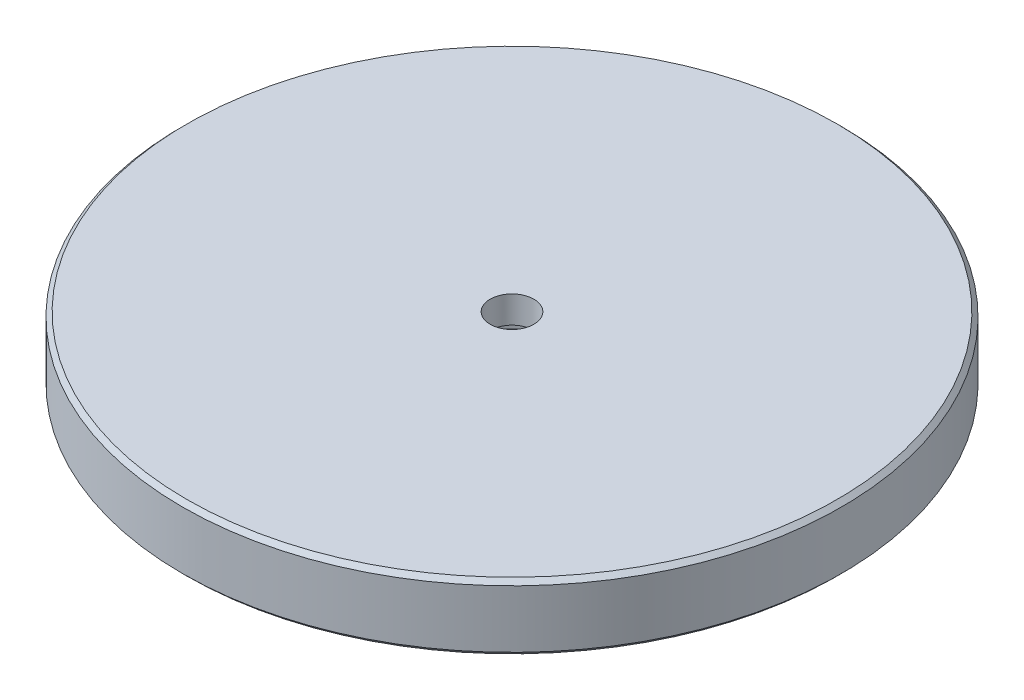
ISO-10303-21;
HEADER;
FILE_DESCRIPTION(('STEP AP214'),'2;1');
FILE_NAME('part.step','',(''),(''),'','','');
FILE_SCHEMA(('AUTOMOTIVE_DESIGN { 1 0 10303 214 1 1 1 1 }'));
ENDSEC;
DATA;
#1=APPLICATION_CONTEXT('core data for automotive mechanical design processes');
#2=APPLICATION_PROTOCOL_DEFINITION('international standard','automotive_design',2000,#1);
#3=PRODUCT_CONTEXT('',#1,'mechanical');
#4=PRODUCT('Part','Part','',(#3));
#5=PRODUCT_RELATED_PRODUCT_CATEGORY('part','',(#4));
#6=PRODUCT_DEFINITION_FORMATION('','',#4);
#7=PRODUCT_DEFINITION_CONTEXT('part definition',#1,'design');
#8=PRODUCT_DEFINITION('design','',#6,#7);
#9=PRODUCT_DEFINITION_SHAPE('','',#8);
#10=(LENGTH_UNIT() NAMED_UNIT(*) SI_UNIT(.MILLI.,.METRE.));
#11=(NAMED_UNIT(*) PLANE_ANGLE_UNIT() SI_UNIT($,.RADIAN.));
#12=(NAMED_UNIT(*) SI_UNIT($,.STERADIAN.) SOLID_ANGLE_UNIT());
#13=UNCERTAINTY_MEASURE_WITH_UNIT(LENGTH_MEASURE(1.E-05),#10,'distance_accuracy_value','');
#14=(GEOMETRIC_REPRESENTATION_CONTEXT(3) GLOBAL_UNCERTAINTY_ASSIGNED_CONTEXT((#13)) GLOBAL_UNIT_ASSIGNED_CONTEXT((#10,
#11,#12)) REPRESENTATION_CONTEXT('',''));
#15=CARTESIAN_POINT('',(0.,0.,0.));
#16=DIRECTION('',(0.,0.,1.));
#17=DIRECTION('',(1.,0.,0.));
#18=AXIS2_PLACEMENT_3D('',#15,#16,#17);
#19=CARTESIAN_POINT('',(0.,15.2,0.));
#20=DIRECTION('',(0.,-1.,0.));
#21=DIRECTION('',(0.,0.,-1.));
#22=AXIS2_PLACEMENT_3D('',#19,#20,#21);
#23=CYLINDRICAL_SURFACE('',#22,75.5);
#24=CARTESIAN_POINT('',(0.,14.2,0.));
#25=DIRECTION('',(0.,1.,0.));
#26=DIRECTION('',(0.,0.,1.));
#27=AXIS2_PLACEMENT_3D('',#24,#25,#26);
#28=CIRCLE('',#27,75.5);
#29=CARTESIAN_POINT('',(0.,14.2,-75.5));
#30=VERTEX_POINT('',#29);
#31=EDGE_CURVE('E37',#30,#30,#28,.F.);
#32=CARTESIAN_POINT('',(0.,1.00000000000007,0.));
#33=DIRECTION('',(0.,1.,0.));
#34=DIRECTION('',(0.,0.,1.));
#35=AXIS2_PLACEMENT_3D('',#32,#33,#34);
#36=CIRCLE('',#35,75.5);
#37=CARTESIAN_POINT('',(0.,1.00000000000007,-75.5));
#38=VERTEX_POINT('',#37);
#39=EDGE_CURVE('E41',#38,#38,#36,.T.);
#40=CARTESIAN_POINT('',(0.,14.2,-75.5));
#41=CARTESIAN_POINT('',(0.,14.0625,-75.5));
#42=CARTESIAN_POINT('',(0.,13.925,-75.5));
#43=CARTESIAN_POINT('',(0.,13.65,-75.5));
#44=CARTESIAN_POINT('',(0.,13.5125,-75.5));
#45=CARTESIAN_POINT('',(0.,13.2375,-75.5));
#46=CARTESIAN_POINT('',(0.,13.1,-75.5));
#47=CARTESIAN_POINT('',(0.,12.825,-75.5));
#48=CARTESIAN_POINT('',(0.,12.6875,-75.5));
#49=CARTESIAN_POINT('',(0.,12.4125,-75.5));
#50=CARTESIAN_POINT('',(0.,12.275,-75.5));
#51=CARTESIAN_POINT('',(0.,12.,-75.5));
#52=CARTESIAN_POINT('',(0.,11.8625,-75.5));
#53=CARTESIAN_POINT('',(0.,11.5875,-75.5));
#54=CARTESIAN_POINT('',(0.,11.45,-75.5));
#55=CARTESIAN_POINT('',(0.,11.175,-75.5));
#56=CARTESIAN_POINT('',(0.,11.0375,-75.5));
#57=CARTESIAN_POINT('',(0.,10.7625,-75.5));
#58=CARTESIAN_POINT('',(0.,10.625,-75.5));
#59=CARTESIAN_POINT('',(0.,10.35,-75.5));
#60=CARTESIAN_POINT('',(0.,10.2125,-75.5));
#61=CARTESIAN_POINT('',(0.,9.93750000000003,-75.5));
#62=CARTESIAN_POINT('',(0.,9.80000000000003,-75.5));
#63=CARTESIAN_POINT('',(0.,9.52500000000003,-75.5));
#64=CARTESIAN_POINT('',(0.,9.38750000000003,-75.5));
#65=CARTESIAN_POINT('',(0.,9.11250000000004,-75.5));
#66=CARTESIAN_POINT('',(0.,8.97500000000004,-75.5));
#67=CARTESIAN_POINT('',(0.,8.70000000000004,-75.5));
#68=CARTESIAN_POINT('',(0.,8.56250000000004,-75.5));
#69=CARTESIAN_POINT('',(0.,8.28750000000004,-75.5));
#70=CARTESIAN_POINT('',(0.,8.15000000000004,-75.5));
#71=CARTESIAN_POINT('',(0.,7.87500000000004,-75.5));
#72=CARTESIAN_POINT('',(0.,7.73750000000004,-75.5));
#73=CARTESIAN_POINT('',(0.,7.46250000000004,-75.5));
#74=CARTESIAN_POINT('',(0.,7.32500000000004,-75.5));
#75=CARTESIAN_POINT('',(0.,7.05000000000005,-75.5));
#76=CARTESIAN_POINT('',(0.,6.91250000000004,-75.5));
#77=CARTESIAN_POINT('',(0.,6.63750000000005,-75.5));
#78=CARTESIAN_POINT('',(0.,6.50000000000004,-75.5));
#79=CARTESIAN_POINT('',(0.,6.22500000000005,-75.5));
#80=CARTESIAN_POINT('',(0.,6.08750000000005,-75.5));
#81=CARTESIAN_POINT('',(0.,5.81250000000005,-75.5));
#82=CARTESIAN_POINT('',(0.,5.67500000000005,-75.5));
#83=CARTESIAN_POINT('',(0.,5.40000000000005,-75.5));
#84=CARTESIAN_POINT('',(0.,5.26250000000005,-75.5));
#85=CARTESIAN_POINT('',(0.,4.98750000000005,-75.5));
#86=CARTESIAN_POINT('',(0.,4.85000000000005,-75.5));
#87=CARTESIAN_POINT('',(0.,4.57500000000005,-75.5));
#88=CARTESIAN_POINT('',(0.,4.43750000000006,-75.5));
#89=CARTESIAN_POINT('',(0.,4.16250000000006,-75.5));
#90=CARTESIAN_POINT('',(0.,4.02500000000006,-75.5));
#91=CARTESIAN_POINT('',(0.,3.75000000000006,-75.5));
#92=CARTESIAN_POINT('',(0.,3.61250000000006,-75.5));
#93=CARTESIAN_POINT('',(0.,3.33750000000006,-75.5));
#94=CARTESIAN_POINT('',(0.,3.20000000000006,-75.5));
#95=CARTESIAN_POINT('',(0.,2.92500000000006,-75.5));
#96=CARTESIAN_POINT('',(0.,2.78750000000006,-75.5));
#97=CARTESIAN_POINT('',(0.,2.51250000000006,-75.5));
#98=CARTESIAN_POINT('',(0.,2.37500000000006,-75.5));
#99=CARTESIAN_POINT('',(0.,2.10000000000007,-75.5));
#100=CARTESIAN_POINT('',(0.,1.96250000000007,-75.5));
#101=CARTESIAN_POINT('',(0.,1.68750000000007,-75.5));
#102=CARTESIAN_POINT('',(0.,1.55000000000007,-75.5));
#103=CARTESIAN_POINT('',(0.,1.27500000000007,-75.5));
#104=CARTESIAN_POINT('',(0.,1.13750000000007,-75.5));
#105=CARTESIAN_POINT('',(0.,1.00000000000007,-75.5));
#106=B_SPLINE_CURVE_WITH_KNOTS('',3,(#40,#41,#42,#43,#44,#45,#46,#47,#48,#49,#50,#51,#52,#53,
#54,#55,#56,#57,#58,#59,#60,#61,#62,#63,#64,#65,#66,#67,#68,#69,#70,#71,#72,#73,#74,#75,#76,#77,
#78,#79,#80,#81,#82,#83,#84,#85,#86,#87,#88,#89,#90,#91,#92,#93,#94,#95,#96,#97,#98,#99,#100,
#101,#102,#103,#104,#105),.UNSPECIFIED.,.F.,.F.,(4,2,2,2,2,2,2,2,2,2,2,2,2,2,2,2,2,2,2,2,2,2,2,
2,2,2,2,2,2,2,2,2,4),(0.,0.4125,0.824999999999998,1.2375,1.64999999999999,2.06249999999999,
2.47499999999999,2.88749999999999,3.29999999999999,3.71249999999998,4.12499999999998,
4.53749999999998,4.94999999999998,5.36249999999998,5.77499999999998,6.18749999999997,
6.59999999999997,7.01249999999997,7.42499999999997,7.83749999999997,8.24999999999996,
8.66249999999996,9.07499999999996,9.48749999999996,9.89999999999996,10.3125,10.725,11.1375,
11.55,11.9624999999999,12.3749999999999,12.7874999999999,13.1999999999999),.UNSPECIFIED.);
#107=EDGE_CURVE('BSEAM30',#30,#38,#106,.T.);
#108=ORIENTED_EDGE('',*,*,#31,.T.);
#109=ORIENTED_EDGE('',*,*,#39,.T.);
#110=ORIENTED_EDGE('',*,*,#107,.T.);
#111=ORIENTED_EDGE('',*,*,#107,.F.);
#112=EDGE_LOOP('',(#108,#110,#109,#111));
#113=FACE_BOUND('',#112,.T.);
#114=ADVANCED_FACE('F30',(#113),#23,.T.);
#115=CARTESIAN_POINT('',(0.,15.2,0.));
#116=DIRECTION('',(0.,1.,0.));
#117=DIRECTION('',(0.,0.,1.));
#118=AXIS2_PLACEMENT_3D('',#115,#116,#117);
#119=PLANE('',#118);
#120=CARTESIAN_POINT('',(0.,15.2,0.));
#121=DIRECTION('',(0.,1.,0.));
#122=DIRECTION('',(0.,0.,1.));
#123=AXIS2_PLACEMENT_3D('',#120,#121,#122);
#124=CIRCLE('',#123,74.5);
#125=CARTESIAN_POINT('',(0.,15.2,74.5));
#126=VERTEX_POINT('',#125);
#127=EDGE_CURVE('E45',#126,#126,#124,.T.);
#128=ORIENTED_EDGE('',*,*,#127,.T.);
#129=EDGE_LOOP('',(#128));
#130=FACE_BOUND('',#129,.T.);
#131=CARTESIAN_POINT('',(0.,15.2,0.));
#132=DIRECTION('',(0.,1.,0.));
#133=DIRECTION('',(0.,0.,1.));
#134=AXIS2_PLACEMENT_3D('',#131,#132,#133);
#135=CIRCLE('',#134,5.);
#136=CARTESIAN_POINT('',(0.,15.2,5.));
#137=VERTEX_POINT('',#136);
#138=EDGE_CURVE('E59',#137,#137,#135,.T.);
#139=ORIENTED_EDGE('',*,*,#138,.F.);
#140=EDGE_LOOP('',(#139));
#141=FACE_BOUND('',#140,.T.);
#142=ADVANCED_FACE('F83',(#130,#141),#119,.T.);
#143=CARTESIAN_POINT('',(0.,0.,0.));
#144=DIRECTION('',(0.,1.,0.));
#145=DIRECTION('',(0.,0.,1.));
#146=AXIS2_PLACEMENT_3D('',#143,#144,#145);
#147=PLANE('',#146);
#148=CARTESIAN_POINT('',(0.,0.,0.));
#149=DIRECTION('',(0.,1.,0.));
#150=DIRECTION('',(0.,0.,1.));
#151=AXIS2_PLACEMENT_3D('',#148,#149,#150);
#152=CIRCLE('',#151,74.4999999999999);
#153=CARTESIAN_POINT('',(0.,0.,74.4999999999999));
#154=VERTEX_POINT('',#153);
#155=EDGE_CURVE('E10',#154,#154,#152,.F.);
#156=ORIENTED_EDGE('',*,*,#155,.T.);
#157=EDGE_LOOP('',(#156));
#158=FACE_BOUND('',#157,.T.);
#159=CARTESIAN_POINT('',(0.,0.,0.));
#160=DIRECTION('',(0.,1.,0.));
#161=DIRECTION('',(0.,0.,1.));
#162=AXIS2_PLACEMENT_3D('',#159,#160,#161);
#163=CIRCLE('',#162,16.2);
#164=CARTESIAN_POINT('',(0.,0.,16.2));
#165=VERTEX_POINT('',#164);
#166=EDGE_CURVE('E50',#165,#165,#163,.T.);
#167=ORIENTED_EDGE('',*,*,#166,.T.);
#168=EDGE_LOOP('',(#167));
#169=FACE_BOUND('',#168,.T.);
#170=ADVANCED_FACE('F77',(#158,#169),#147,.F.);
#171=CARTESIAN_POINT('',(0.,9.,0.));
#172=DIRECTION('',(0.,-1.,0.));
#173=DIRECTION('',(0.,0.,-1.));
#174=AXIS2_PLACEMENT_3D('',#171,#172,#173);
#175=CYLINDRICAL_SURFACE('',#174,15.2);
#176=CARTESIAN_POINT('',(0.,0.999999999999964,0.));
#177=DIRECTION('',(0.,1.,0.));
#178=DIRECTION('',(0.,0.,1.));
#179=AXIS2_PLACEMENT_3D('',#176,#177,#178);
#180=CIRCLE('',#179,15.2);
#181=CARTESIAN_POINT('',(0.,0.999999999999964,15.2));
#182=VERTEX_POINT('',#181);
#183=EDGE_CURVE('E53',#182,#182,#180,.F.);
#184=ORIENTED_EDGE('',*,*,#183,.T.);
#185=EDGE_LOOP('',(#184));
#186=FACE_BOUND('',#185,.T.);
#187=CARTESIAN_POINT('',(0.,9.,0.));
#188=DIRECTION('',(0.,-1.,0.));
#189=DIRECTION('',(0.,0.,-1.));
#190=AXIS2_PLACEMENT_3D('',#187,#188,#189);
#191=CIRCLE('',#190,15.2);
#192=CARTESIAN_POINT('',(0.,9.,-15.2));
#193=VERTEX_POINT('',#192);
#194=EDGE_CURVE('E56',#193,#193,#191,.T.);
#195=ORIENTED_EDGE('',*,*,#194,.F.);
#196=EDGE_LOOP('',(#195));
#197=FACE_BOUND('',#196,.T.);
#198=ADVANCED_FACE('F72',(#186,#197),#175,.F.);
#199=CARTESIAN_POINT('',(0.,9.,0.));
#200=DIRECTION('',(0.,-1.,0.));
#201=DIRECTION('',(0.,0.,-1.));
#202=AXIS2_PLACEMENT_3D('',#199,#200,#201);
#203=PLANE('',#202);
#204=CARTESIAN_POINT('',(0.,9.,0.));
#205=DIRECTION('',(0.,-1.,0.));
#206=DIRECTION('',(0.,0.,-1.));
#207=AXIS2_PLACEMENT_3D('',#204,#205,#206);
#208=CIRCLE('',#207,5.);
#209=CARTESIAN_POINT('',(0.,9.,-5.));
#210=VERTEX_POINT('',#209);
#211=EDGE_CURVE('E62',#210,#210,#208,.T.);
#212=ORIENTED_EDGE('',*,*,#211,.F.);
#213=EDGE_LOOP('',(#212));
#214=FACE_BOUND('',#213,.T.);
#215=ORIENTED_EDGE('',*,*,#194,.T.);
#216=EDGE_LOOP('',(#215));
#217=FACE_BOUND('',#216,.T.);
#218=ADVANCED_FACE('F68',(#214,#217),#203,.T.);
#219=CARTESIAN_POINT('',(0.,0.999999999999964,0.));
#220=DIRECTION('',(0.,-1.,0.));
#221=DIRECTION('',(0.,0.,-1.));
#222=AXIS2_PLACEMENT_3D('',#219,#220,#221);
#223=CONICAL_SURFACE('',#222,15.2,0.785398163397462);
#224=ORIENTED_EDGE('',*,*,#166,.F.);
#225=EDGE_LOOP('',(#224));
#226=FACE_BOUND('',#225,.T.);
#227=ORIENTED_EDGE('',*,*,#183,.F.);
#228=EDGE_LOOP('',(#227));
#229=FACE_BOUND('',#228,.T.);
#230=ADVANCED_FACE('F71',(#226,#229),#223,.F.);
#231=CARTESIAN_POINT('',(0.,37.,0.));
#232=DIRECTION('',(0.,-1.,0.));
#233=DIRECTION('',(0.,0.,-1.));
#234=AXIS2_PLACEMENT_3D('',#231,#232,#233);
#235=CYLINDRICAL_SURFACE('',#234,5.);
#236=ORIENTED_EDGE('',*,*,#138,.T.);
#237=EDGE_LOOP('',(#236));
#238=FACE_BOUND('',#237,.T.);
#239=ORIENTED_EDGE('',*,*,#211,.T.);
#240=EDGE_LOOP('',(#239));
#241=FACE_BOUND('',#240,.T.);
#242=ADVANCED_FACE('F66',(#238,#241),#235,.F.);
#243=CARTESIAN_POINT('',(0.,15.2,0.));
#244=DIRECTION('',(0.,-1.,0.));
#245=DIRECTION('',(0.,0.,-1.));
#246=AXIS2_PLACEMENT_3D('',#243,#244,#245);
#247=CONICAL_SURFACE('',#246,74.5,0.785398163397441);
#248=ORIENTED_EDGE('',*,*,#31,.F.);
#249=EDGE_LOOP('',(#248));
#250=FACE_BOUND('',#249,.T.);
#251=ORIENTED_EDGE('',*,*,#127,.F.);
#252=EDGE_LOOP('',(#251));
#253=FACE_BOUND('',#252,.T.);
#254=ADVANCED_FACE('F96',(#250,#253),#247,.T.);
#255=CARTESIAN_POINT('',(0.,1.00000000000007,0.));
#256=DIRECTION('',(0.,1.,0.));
#257=DIRECTION('',(0.,0.,1.));
#258=AXIS2_PLACEMENT_3D('',#255,#256,#257);
#259=CONICAL_SURFACE('',#258,75.5,0.785398163397448);
#260=ORIENTED_EDGE('',*,*,#155,.F.);
#261=EDGE_LOOP('',(#260));
#262=FACE_BOUND('',#261,.T.);
#263=ORIENTED_EDGE('',*,*,#39,.F.);
#264=EDGE_LOOP('',(#263));
#265=FACE_BOUND('',#264,.T.);
#266=ADVANCED_FACE('F32',(#262,#265),#259,.T.);
#267=CLOSED_SHELL('',(#114,#142,#170,#198,#218,#230,#242,#254,#266));
#268=MANIFOLD_SOLID_BREP('B2',#267);
#269=ADVANCED_BREP_SHAPE_REPRESENTATION('',(#18,#268),#14);
#270=SHAPE_DEFINITION_REPRESENTATION(#9,#269);
ENDSEC;
END-ISO-10303-21;
